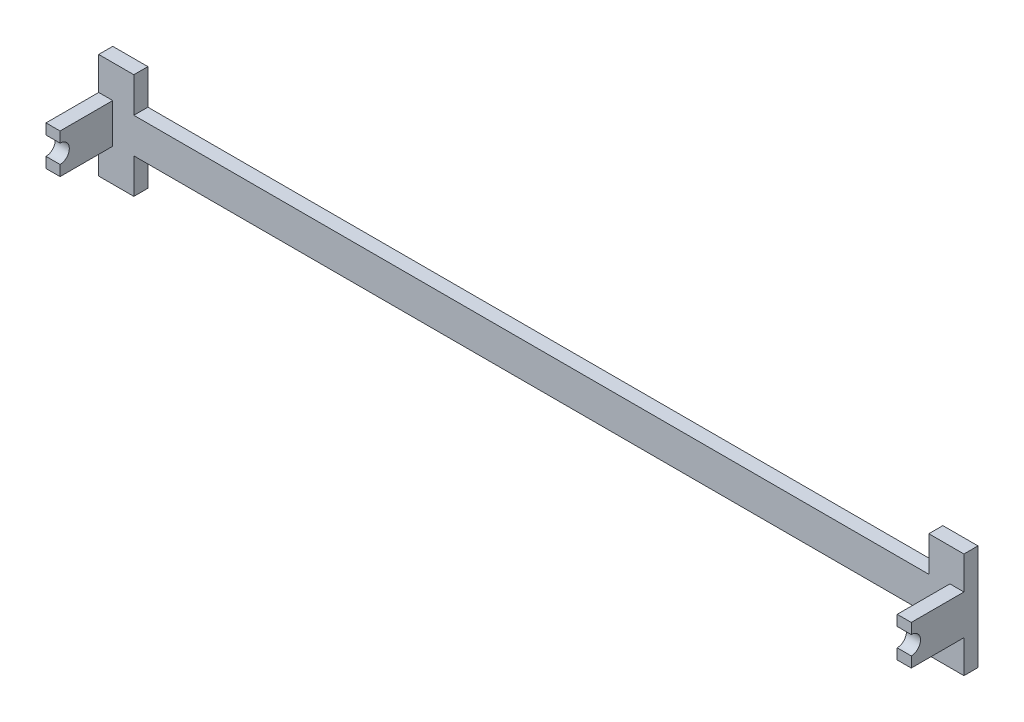
ISO-10303-21;
HEADER;
FILE_DESCRIPTION(('STEP AP214'),'2;1');
FILE_NAME('part.step','',(''),(''),'','','');
FILE_SCHEMA(('AUTOMOTIVE_DESIGN { 1 0 10303 214 1 1 1 1 }'));
ENDSEC;
DATA;
#1=APPLICATION_CONTEXT('core data for automotive mechanical design processes');
#2=APPLICATION_PROTOCOL_DEFINITION('international standard','automotive_design',2000,#1);
#3=PRODUCT_CONTEXT('',#1,'mechanical');
#4=PRODUCT('Part','Part','',(#3));
#5=PRODUCT_RELATED_PRODUCT_CATEGORY('part','',(#4));
#6=PRODUCT_DEFINITION_FORMATION('','',#4);
#7=PRODUCT_DEFINITION_CONTEXT('part definition',#1,'design');
#8=PRODUCT_DEFINITION('design','',#6,#7);
#9=PRODUCT_DEFINITION_SHAPE('','',#8);
#10=(LENGTH_UNIT() NAMED_UNIT(*) SI_UNIT(.MILLI.,.METRE.));
#11=(NAMED_UNIT(*) PLANE_ANGLE_UNIT() SI_UNIT($,.RADIAN.));
#12=(NAMED_UNIT(*) SI_UNIT($,.STERADIAN.) SOLID_ANGLE_UNIT());
#13=UNCERTAINTY_MEASURE_WITH_UNIT(LENGTH_MEASURE(1.E-05),#10,'distance_accuracy_value','');
#14=(GEOMETRIC_REPRESENTATION_CONTEXT(3) GLOBAL_UNCERTAINTY_ASSIGNED_CONTEXT((#13)) GLOBAL_UNIT_ASSIGNED_CONTEXT((#10,
#11,#12)) REPRESENTATION_CONTEXT('',''));
#15=CARTESIAN_POINT('',(0.,0.,0.));
#16=DIRECTION('',(0.,0.,1.));
#17=DIRECTION('',(1.,0.,0.));
#18=AXIS2_PLACEMENT_3D('',#15,#16,#17);
#19=CARTESIAN_POINT('',(-14.,5.,-19.));
#20=DIRECTION('',(-1.,0.,0.));
#21=DIRECTION('',(0.,0.,1.));
#22=AXIS2_PLACEMENT_3D('',#19,#20,#21);
#23=PLANE('',#22);
#24=DIRECTION('',(0.,-1.,0.));
#25=VECTOR('',#24,1.);
#26=CARTESIAN_POINT('',(-14.,5.,-15.));
#27=LINE('',#26,#25);
#28=CARTESIAN_POINT('',(-14.,15.,-15.));
#29=VERTEX_POINT('',#28);
#30=CARTESIAN_POINT('',(-14.,5.63,-15.));
#31=VERTEX_POINT('',#30);
#32=EDGE_CURVE('E379',#29,#31,#27,.T.);
#33=ORIENTED_EDGE('',*,*,#32,.F.);
#34=DIRECTION('',(0.,0.,-1.));
#35=VECTOR('',#34,1.);
#36=CARTESIAN_POINT('',(-14.,15.,-15.));
#37=LINE('',#36,#35);
#38=CARTESIAN_POINT('',(-14.,15.,-19.));
#39=VERTEX_POINT('',#38);
#40=EDGE_CURVE('E311',#29,#39,#37,.T.);
#41=ORIENTED_EDGE('',*,*,#40,.T.);
#42=DIRECTION('',(0.,-1.,0.));
#43=VECTOR('',#42,1.);
#44=CARTESIAN_POINT('',(-14.,5.,-19.));
#45=LINE('',#44,#43);
#46=CARTESIAN_POINT('',(-14.,-15.,-19.));
#47=VERTEX_POINT('',#46);
#48=EDGE_CURVE('E374',#39,#47,#45,.T.);
#49=ORIENTED_EDGE('',*,*,#48,.T.);
#50=DIRECTION('',(0.,0.,-1.));
#51=VECTOR('',#50,1.);
#52=CARTESIAN_POINT('',(-14.,-15.,-15.));
#53=LINE('',#52,#51);
#54=CARTESIAN_POINT('',(-14.,-15.,-15.));
#55=VERTEX_POINT('',#54);
#56=EDGE_CURVE('E322',#55,#47,#53,.T.);
#57=ORIENTED_EDGE('',*,*,#56,.F.);
#58=CARTESIAN_POINT('',(-14.,-5.63,-15.));
#59=VERTEX_POINT('',#58);
#60=EDGE_CURVE('E373',#59,#55,#27,.T.);
#61=ORIENTED_EDGE('',*,*,#60,.F.);
#62=DIRECTION('',(0.,0.,1.));
#63=VECTOR('',#62,1.);
#64=CARTESIAN_POINT('',(-14.,-5.63,-15.));
#65=LINE('',#64,#63);
#66=CARTESIAN_POINT('',(-14.,-5.63,0.));
#67=VERTEX_POINT('',#66);
#68=EDGE_CURVE('E229',#59,#67,#65,.T.);
#69=ORIENTED_EDGE('',*,*,#68,.T.);
#70=DIRECTION('',(0.,1.,0.));
#71=VECTOR('',#70,1.);
#72=CARTESIAN_POINT('',(-14.,-5.63,0.));
#73=LINE('',#72,#71);
#74=CARTESIAN_POINT('',(-14.,-2.63,0.));
#75=VERTEX_POINT('',#74);
#76=EDGE_CURVE('E226',#67,#75,#73,.T.);
#77=ORIENTED_EDGE('',*,*,#76,.T.);
#78=CARTESIAN_POINT('',(-14.,0.,0.));
#79=DIRECTION('',(1.,0.,0.));
#80=DIRECTION('',(0.,0.,1.));
#81=AXIS2_PLACEMENT_3D('',#78,#79,#80);
#82=CIRCLE('',#81,2.63);
#83=CARTESIAN_POINT('',(-14.,2.63,0.));
#84=VERTEX_POINT('',#83);
#85=EDGE_CURVE('E238',#75,#84,#82,.T.);
#86=ORIENTED_EDGE('',*,*,#85,.T.);
#87=DIRECTION('',(0.,1.,0.));
#88=VECTOR('',#87,1.);
#89=CARTESIAN_POINT('',(-14.,2.63,0.));
#90=LINE('',#89,#88);
#91=CARTESIAN_POINT('',(-14.,5.63,0.));
#92=VERTEX_POINT('',#91);
#93=EDGE_CURVE('E206',#84,#92,#90,.T.);
#94=ORIENTED_EDGE('',*,*,#93,.T.);
#95=DIRECTION('',(0.,0.,-1.));
#96=VECTOR('',#95,1.);
#97=CARTESIAN_POINT('',(-14.,5.63,0.));
#98=LINE('',#97,#96);
#99=EDGE_CURVE('E241',#92,#31,#98,.T.);
#100=ORIENTED_EDGE('',*,*,#99,.T.);
#101=EDGE_LOOP('',(#33,#41,#49,#57,#61,#69,#77,#86,#94,#100));
#102=FACE_BOUND('',#101,.T.);
#103=ADVANCED_FACE('F41',(#102),#23,.T.);
#104=CARTESIAN_POINT('',(-14.,5.,-19.));
#105=DIRECTION('',(0.,1.,0.));
#106=DIRECTION('',(0.,0.,1.));
#107=AXIS2_PLACEMENT_3D('',#104,#105,#106);
#108=PLANE('',#107);
#109=DIRECTION('',(0.,0.,-1.));
#110=VECTOR('',#109,1.);
#111=CARTESIAN_POINT('',(-4.,5.,-19.));
#112=LINE('',#111,#110);
#113=CARTESIAN_POINT('',(-4.,5.,-15.));
#114=VERTEX_POINT('',#113);
#115=CARTESIAN_POINT('',(-4.,5.,-19.));
#116=VERTEX_POINT('',#115);
#117=EDGE_CURVE('E370',#114,#116,#112,.T.);
#118=ORIENTED_EDGE('',*,*,#117,.F.);
#119=DIRECTION('',(-1.,0.,0.));
#120=VECTOR('',#119,1.);
#121=CARTESIAN_POINT('',(-14.,5.,-15.));
#122=LINE('',#121,#120);
#123=CARTESIAN_POINT('',(222.3,5.,-15.));
#124=VERTEX_POINT('',#123);
#125=EDGE_CURVE('E44',#124,#114,#122,.T.);
#126=ORIENTED_EDGE('',*,*,#125,.F.);
#127=DIRECTION('',(0.,0.,1.));
#128=VECTOR('',#127,1.);
#129=CARTESIAN_POINT('',(222.3,5.,-19.));
#130=LINE('',#129,#128);
#131=CARTESIAN_POINT('',(222.3,5.,-19.));
#132=VERTEX_POINT('',#131);
#133=EDGE_CURVE('E364',#132,#124,#130,.T.);
#134=ORIENTED_EDGE('',*,*,#133,.F.);
#135=DIRECTION('',(-1.,0.,0.));
#136=VECTOR('',#135,1.);
#137=CARTESIAN_POINT('',(-14.,5.,-19.));
#138=LINE('',#137,#136);
#139=EDGE_CURVE('E11',#132,#116,#138,.T.);
#140=ORIENTED_EDGE('',*,*,#139,.T.);
#141=EDGE_LOOP('',(#118,#126,#134,#140));
#142=FACE_BOUND('',#141,.T.);
#143=ADVANCED_FACE('F476',(#142),#108,.T.);
#144=CARTESIAN_POINT('',(232.3,5.,-19.));
#145=DIRECTION('',(1.,0.,0.));
#146=DIRECTION('',(0.,0.,-1.));
#147=AXIS2_PLACEMENT_3D('',#144,#145,#146);
#148=PLANE('',#147);
#149=DIRECTION('',(0.,1.,0.));
#150=VECTOR('',#149,1.);
#151=CARTESIAN_POINT('',(232.3,5.,-15.));
#152=LINE('',#151,#150);
#153=CARTESIAN_POINT('',(232.3,-15.,-15.));
#154=VERTEX_POINT('',#153);
#155=CARTESIAN_POINT('',(232.3,-5.63,-15.));
#156=VERTEX_POINT('',#155);
#157=EDGE_CURVE('E384',#154,#156,#152,.T.);
#158=ORIENTED_EDGE('',*,*,#157,.F.);
#159=DIRECTION('',(0.,0.,-1.));
#160=VECTOR('',#159,1.);
#161=CARTESIAN_POINT('',(232.3,-15.,-15.));
#162=LINE('',#161,#160);
#163=CARTESIAN_POINT('',(232.3,-15.,-19.));
#164=VERTEX_POINT('',#163);
#165=EDGE_CURVE('E333',#154,#164,#162,.T.);
#166=ORIENTED_EDGE('',*,*,#165,.T.);
#167=DIRECTION('',(0.,1.,0.));
#168=VECTOR('',#167,1.);
#169=CARTESIAN_POINT('',(232.3,5.,-19.));
#170=LINE('',#169,#168);
#171=CARTESIAN_POINT('',(232.3,15.,-19.));
#172=VERTEX_POINT('',#171);
#173=EDGE_CURVE('E49',#164,#172,#170,.T.);
#174=ORIENTED_EDGE('',*,*,#173,.T.);
#175=DIRECTION('',(0.,0.,-1.));
#176=VECTOR('',#175,1.);
#177=CARTESIAN_POINT('',(232.3,15.,-15.));
#178=LINE('',#177,#176);
#179=CARTESIAN_POINT('',(232.3,15.,-15.));
#180=VERTEX_POINT('',#179);
#181=EDGE_CURVE('E289',#180,#172,#178,.T.);
#182=ORIENTED_EDGE('',*,*,#181,.F.);
#183=CARTESIAN_POINT('',(232.3,5.63,-15.));
#184=VERTEX_POINT('',#183);
#185=EDGE_CURVE('E383',#184,#180,#152,.T.);
#186=ORIENTED_EDGE('',*,*,#185,.F.);
#187=DIRECTION('',(0.,0.,1.));
#188=VECTOR('',#187,1.);
#189=CARTESIAN_POINT('',(232.3,5.63,0.));
#190=LINE('',#189,#188);
#191=CARTESIAN_POINT('',(232.3,5.63,0.));
#192=VERTEX_POINT('',#191);
#193=EDGE_CURVE('E282',#184,#192,#190,.T.);
#194=ORIENTED_EDGE('',*,*,#193,.T.);
#195=DIRECTION('',(0.,-1.,0.));
#196=VECTOR('',#195,1.);
#197=CARTESIAN_POINT('',(232.3,2.63,0.));
#198=LINE('',#197,#196);
#199=CARTESIAN_POINT('',(232.3,2.63,0.));
#200=VERTEX_POINT('',#199);
#201=EDGE_CURVE('E258',#192,#200,#198,.T.);
#202=ORIENTED_EDGE('',*,*,#201,.T.);
#203=CARTESIAN_POINT('',(232.3,0.,0.));
#204=DIRECTION('',(-1.,0.,0.));
#205=DIRECTION('',(0.,0.,-1.));
#206=AXIS2_PLACEMENT_3D('',#203,#204,#205);
#207=CIRCLE('',#206,2.63);
#208=CARTESIAN_POINT('',(232.3,-2.63,0.));
#209=VERTEX_POINT('',#208);
#210=EDGE_CURVE('E247',#200,#209,#207,.T.);
#211=ORIENTED_EDGE('',*,*,#210,.T.);
#212=DIRECTION('',(0.,-1.,0.));
#213=VECTOR('',#212,1.);
#214=CARTESIAN_POINT('',(232.3,-2.63,0.));
#215=LINE('',#214,#213);
#216=CARTESIAN_POINT('',(232.3,-5.63,0.));
#217=VERTEX_POINT('',#216);
#218=EDGE_CURVE('E276',#209,#217,#215,.T.);
#219=ORIENTED_EDGE('',*,*,#218,.T.);
#220=DIRECTION('',(0.,0.,-1.));
#221=VECTOR('',#220,1.);
#222=CARTESIAN_POINT('',(232.3,-5.63,-15.));
#223=LINE('',#222,#221);
#224=EDGE_CURVE('E279',#217,#156,#223,.T.);
#225=ORIENTED_EDGE('',*,*,#224,.T.);
#226=EDGE_LOOP('',(#158,#166,#174,#182,#186,#194,#202,#211,#219,#225));
#227=FACE_BOUND('',#226,.T.);
#228=ADVANCED_FACE('F395',(#227),#148,.T.);
#229=CARTESIAN_POINT('',(-14.,-5.,-19.));
#230=DIRECTION('',(0.,-1.,0.));
#231=DIRECTION('',(0.,0.,-1.));
#232=AXIS2_PLACEMENT_3D('',#229,#230,#231);
#233=PLANE('',#232);
#234=DIRECTION('',(0.,0.,1.));
#235=VECTOR('',#234,1.);
#236=CARTESIAN_POINT('',(-4.,-5.,-19.));
#237=LINE('',#236,#235);
#238=CARTESIAN_POINT('',(-4.,-4.99999999999999,-19.));
#239=VERTEX_POINT('',#238);
#240=CARTESIAN_POINT('',(-4.,-5.,-15.));
#241=VERTEX_POINT('',#240);
#242=EDGE_CURVE('E367',#239,#241,#237,.T.);
#243=ORIENTED_EDGE('',*,*,#242,.F.);
#244=DIRECTION('',(1.,0.,0.));
#245=VECTOR('',#244,1.);
#246=CARTESIAN_POINT('',(-14.,-5.,-19.));
#247=LINE('',#246,#245);
#248=CARTESIAN_POINT('',(222.3,-5.,-19.));
#249=VERTEX_POINT('',#248);
#250=EDGE_CURVE('E376',#239,#249,#247,.T.);
#251=ORIENTED_EDGE('',*,*,#250,.T.);
#252=DIRECTION('',(0.,0.,-1.));
#253=VECTOR('',#252,1.);
#254=CARTESIAN_POINT('',(222.3,-5.,-19.));
#255=LINE('',#254,#253);
#256=CARTESIAN_POINT('',(222.3,-5.,-15.));
#257=VERTEX_POINT('',#256);
#258=EDGE_CURVE('E325',#257,#249,#255,.T.);
#259=ORIENTED_EDGE('',*,*,#258,.F.);
#260=DIRECTION('',(1.,0.,0.));
#261=VECTOR('',#260,1.);
#262=CARTESIAN_POINT('',(-14.,-5.,-15.));
#263=LINE('',#262,#261);
#264=EDGE_CURVE('E381',#241,#257,#263,.T.);
#265=ORIENTED_EDGE('',*,*,#264,.F.);
#266=EDGE_LOOP('',(#243,#251,#259,#265));
#267=FACE_BOUND('',#266,.T.);
#268=ADVANCED_FACE('F486',(#267),#233,.T.);
#269=CARTESIAN_POINT('',(0.,0.,-19.));
#270=DIRECTION('',(0.,0.,1.));
#271=DIRECTION('',(1.,0.,0.));
#272=AXIS2_PLACEMENT_3D('',#269,#270,#271);
#273=PLANE('',#272);
#274=ORIENTED_EDGE('',*,*,#250,.F.);
#275=DIRECTION('',(0.,-1.,0.));
#276=VECTOR('',#275,1.);
#277=CARTESIAN_POINT('',(-4.,15.,-19.));
#278=LINE('',#277,#276);
#279=CARTESIAN_POINT('',(-4.,-15.,-19.));
#280=VERTEX_POINT('',#279);
#281=EDGE_CURVE('E315',#239,#280,#278,.T.);
#282=ORIENTED_EDGE('',*,*,#281,.T.);
#283=DIRECTION('',(-1.,0.,0.));
#284=VECTOR('',#283,1.);
#285=CARTESIAN_POINT('',(-14.,-15.,-19.));
#286=LINE('',#285,#284);
#287=EDGE_CURVE('E304',#280,#47,#286,.T.);
#288=ORIENTED_EDGE('',*,*,#287,.T.);
#289=ORIENTED_EDGE('',*,*,#48,.F.);
#290=DIRECTION('',(1.,0.,0.));
#291=VECTOR('',#290,1.);
#292=CARTESIAN_POINT('',(-14.,15.,-19.));
#293=LINE('',#292,#291);
#294=CARTESIAN_POINT('',(-4.,15.,-19.));
#295=VERTEX_POINT('',#294);
#296=EDGE_CURVE('E312',#39,#295,#293,.T.);
#297=ORIENTED_EDGE('',*,*,#296,.T.);
#298=EDGE_CURVE('E317',#295,#116,#278,.T.);
#299=ORIENTED_EDGE('',*,*,#298,.T.);
#300=ORIENTED_EDGE('',*,*,#139,.F.);
#301=DIRECTION('',(0.,1.,0.));
#302=VECTOR('',#301,1.);
#303=CARTESIAN_POINT('',(222.3,-15.,-19.));
#304=LINE('',#303,#302);
#305=CARTESIAN_POINT('',(222.3,15.,-19.));
#306=VERTEX_POINT('',#305);
#307=EDGE_CURVE('E347',#132,#306,#304,.T.);
#308=ORIENTED_EDGE('',*,*,#307,.T.);
#309=DIRECTION('',(1.,0.,0.));
#310=VECTOR('',#309,1.);
#311=CARTESIAN_POINT('',(232.3,15.,-19.));
#312=LINE('',#311,#310);
#313=EDGE_CURVE('E344',#306,#172,#312,.T.);
#314=ORIENTED_EDGE('',*,*,#313,.T.);
#315=ORIENTED_EDGE('',*,*,#173,.F.);
#316=DIRECTION('',(-1.,0.,0.));
#317=VECTOR('',#316,1.);
#318=CARTESIAN_POINT('',(232.3,-15.,-19.));
#319=LINE('',#318,#317);
#320=CARTESIAN_POINT('',(222.3,-15.,-19.));
#321=VERTEX_POINT('',#320);
#322=EDGE_CURVE('E316',#164,#321,#319,.T.);
#323=ORIENTED_EDGE('',*,*,#322,.T.);
#324=EDGE_CURVE('E349',#321,#249,#304,.T.);
#325=ORIENTED_EDGE('',*,*,#324,.T.);
#326=EDGE_LOOP('',(#274,#282,#288,#289,#297,#299,#300,#308,#314,#315,#323,#325));
#327=FACE_BOUND('',#326,.T.);
#328=ADVANCED_FACE('F490',(#327),#273,.F.);
#329=CARTESIAN_POINT('',(0.,0.,-15.));
#330=DIRECTION('',(0.,0.,1.));
#331=DIRECTION('',(1.,0.,0.));
#332=AXIS2_PLACEMENT_3D('',#329,#330,#331);
#333=PLANE('',#332);
#334=DIRECTION('',(-1.,0.,0.));
#335=VECTOR('',#334,1.);
#336=CARTESIAN_POINT('',(-10.,-5.63,-15.));
#337=LINE('',#336,#335);
#338=CARTESIAN_POINT('',(-10.,-5.63,-15.));
#339=VERTEX_POINT('',#338);
#340=EDGE_CURVE('E250',#339,#59,#337,.T.);
#341=ORIENTED_EDGE('',*,*,#340,.T.);
#342=ORIENTED_EDGE('',*,*,#60,.T.);
#343=DIRECTION('',(-1.,0.,0.));
#344=VECTOR('',#343,1.);
#345=CARTESIAN_POINT('',(-14.,-15.,-15.));
#346=LINE('',#345,#344);
#347=CARTESIAN_POINT('',(-4.,-15.,-15.));
#348=VERTEX_POINT('',#347);
#349=EDGE_CURVE('E308',#348,#55,#346,.T.);
#350=ORIENTED_EDGE('',*,*,#349,.F.);
#351=DIRECTION('',(0.,-1.,0.));
#352=VECTOR('',#351,1.);
#353=CARTESIAN_POINT('',(-4.,15.,-15.));
#354=LINE('',#353,#352);
#355=EDGE_CURVE('E303',#241,#348,#354,.T.);
#356=ORIENTED_EDGE('',*,*,#355,.F.);
#357=ORIENTED_EDGE('',*,*,#264,.T.);
#358=DIRECTION('',(0.,1.,0.));
#359=VECTOR('',#358,1.);
#360=CARTESIAN_POINT('',(222.3,-15.,-15.));
#361=LINE('',#360,#359);
#362=CARTESIAN_POINT('',(222.3,-15.,-15.));
#363=VERTEX_POINT('',#362);
#364=EDGE_CURVE('E357',#363,#257,#361,.T.);
#365=ORIENTED_EDGE('',*,*,#364,.F.);
#366=DIRECTION('',(-1.,0.,0.));
#367=VECTOR('',#366,1.);
#368=CARTESIAN_POINT('',(232.3,-15.,-15.));
#369=LINE('',#368,#367);
#370=EDGE_CURVE('E348',#154,#363,#369,.T.);
#371=ORIENTED_EDGE('',*,*,#370,.F.);
#372=ORIENTED_EDGE('',*,*,#157,.T.);
#373=DIRECTION('',(1.,0.,0.));
#374=VECTOR('',#373,1.);
#375=CARTESIAN_POINT('',(228.3,-5.63,-15.));
#376=LINE('',#375,#374);
#377=CARTESIAN_POINT('',(228.3,-5.63,-15.));
#378=VERTEX_POINT('',#377);
#379=EDGE_CURVE('E295',#378,#156,#376,.T.);
#380=ORIENTED_EDGE('',*,*,#379,.F.);
#381=DIRECTION('',(0.,1.,0.));
#382=VECTOR('',#381,1.);
#383=CARTESIAN_POINT('',(228.3,5.63,-15.));
#384=LINE('',#383,#382);
#385=CARTESIAN_POINT('',(228.3,5.63,-15.));
#386=VERTEX_POINT('',#385);
#387=EDGE_CURVE('E264',#378,#386,#384,.T.);
#388=ORIENTED_EDGE('',*,*,#387,.T.);
#389=DIRECTION('',(1.,0.,0.));
#390=VECTOR('',#389,1.);
#391=CARTESIAN_POINT('',(228.3,5.63,-15.));
#392=LINE('',#391,#390);
#393=EDGE_CURVE('E292',#386,#184,#392,.T.);
#394=ORIENTED_EDGE('',*,*,#393,.T.);
#395=ORIENTED_EDGE('',*,*,#185,.T.);
#396=DIRECTION('',(1.,0.,0.));
#397=VECTOR('',#396,1.);
#398=CARTESIAN_POINT('',(232.3,15.,-15.));
#399=LINE('',#398,#397);
#400=CARTESIAN_POINT('',(222.3,15.,-15.));
#401=VERTEX_POINT('',#400);
#402=EDGE_CURVE('E336',#401,#180,#399,.T.);
#403=ORIENTED_EDGE('',*,*,#402,.F.);
#404=EDGE_CURVE('E356',#124,#401,#361,.T.);
#405=ORIENTED_EDGE('',*,*,#404,.F.);
#406=ORIENTED_EDGE('',*,*,#125,.T.);
#407=CARTESIAN_POINT('',(-4.,15.,-15.));
#408=VERTEX_POINT('',#407);
#409=EDGE_CURVE('E305',#408,#114,#354,.T.);
#410=ORIENTED_EDGE('',*,*,#409,.F.);
#411=DIRECTION('',(1.,0.,0.));
#412=VECTOR('',#411,1.);
#413=CARTESIAN_POINT('',(-14.,15.,-15.));
#414=LINE('',#413,#412);
#415=EDGE_CURVE('E300',#29,#408,#414,.T.);
#416=ORIENTED_EDGE('',*,*,#415,.F.);
#417=ORIENTED_EDGE('',*,*,#32,.T.);
#418=DIRECTION('',(-1.,0.,0.));
#419=VECTOR('',#418,1.);
#420=CARTESIAN_POINT('',(-10.,5.63,-15.));
#421=LINE('',#420,#419);
#422=CARTESIAN_POINT('',(-10.,5.63,-15.));
#423=VERTEX_POINT('',#422);
#424=EDGE_CURVE('E62',#423,#31,#421,.T.);
#425=ORIENTED_EDGE('',*,*,#424,.F.);
#426=DIRECTION('',(0.,-1.,0.));
#427=VECTOR('',#426,1.);
#428=CARTESIAN_POINT('',(-10.,5.63,-15.));
#429=LINE('',#428,#427);
#430=EDGE_CURVE('E57',#423,#339,#429,.T.);
#431=ORIENTED_EDGE('',*,*,#430,.T.);
#432=EDGE_LOOP('',(#341,#342,#350,#356,#357,#365,#371,#372,#380,#388,#394,#395,#403,#405,#406,
#410,#416,#417,#425,#431));
#433=FACE_BOUND('',#432,.T.);
#434=ADVANCED_FACE('F392',(#433),#333,.T.);
#435=CARTESIAN_POINT('',(232.3,-15.,-15.));
#436=DIRECTION('',(0.,-1.,0.));
#437=DIRECTION('',(0.,0.,-1.));
#438=AXIS2_PLACEMENT_3D('',#435,#436,#437);
#439=PLANE('',#438);
#440=ORIENTED_EDGE('',*,*,#322,.F.);
#441=ORIENTED_EDGE('',*,*,#165,.F.);
#442=ORIENTED_EDGE('',*,*,#370,.T.);
#443=DIRECTION('',(0.,0.,-1.));
#444=VECTOR('',#443,1.);
#445=CARTESIAN_POINT('',(222.3,-15.,-15.));
#446=LINE('',#445,#444);
#447=EDGE_CURVE('E337',#363,#321,#446,.T.);
#448=ORIENTED_EDGE('',*,*,#447,.T.);
#449=EDGE_LOOP('',(#440,#441,#442,#448));
#450=FACE_BOUND('',#449,.T.);
#451=ADVANCED_FACE('F443',(#450),#439,.T.);
#452=CARTESIAN_POINT('',(222.3,-15.,-15.));
#453=DIRECTION('',(-1.,0.,0.));
#454=DIRECTION('',(0.,0.,1.));
#455=AXIS2_PLACEMENT_3D('',#452,#453,#454);
#456=PLANE('',#455);
#457=ORIENTED_EDGE('',*,*,#364,.T.);
#458=ORIENTED_EDGE('',*,*,#258,.T.);
#459=ORIENTED_EDGE('',*,*,#324,.F.);
#460=ORIENTED_EDGE('',*,*,#447,.F.);
#461=EDGE_LOOP('',(#457,#458,#459,#460));
#462=FACE_BOUND('',#461,.T.);
#463=ADVANCED_FACE('F439',(#462),#456,.T.);
#464=CARTESIAN_POINT('',(-14.,-15.,-15.));
#465=DIRECTION('',(0.,-1.,0.));
#466=DIRECTION('',(1.,0.,0.));
#467=AXIS2_PLACEMENT_3D('',#464,#465,#466);
#468=PLANE('',#467);
#469=ORIENTED_EDGE('',*,*,#287,.F.);
#470=DIRECTION('',(0.,0.,-1.));
#471=VECTOR('',#470,1.);
#472=CARTESIAN_POINT('',(-4.,-15.,-15.));
#473=LINE('',#472,#471);
#474=EDGE_CURVE('E326',#348,#280,#473,.T.);
#475=ORIENTED_EDGE('',*,*,#474,.F.);
#476=ORIENTED_EDGE('',*,*,#349,.T.);
#477=ORIENTED_EDGE('',*,*,#56,.T.);
#478=EDGE_LOOP('',(#469,#475,#476,#477));
#479=FACE_BOUND('',#478,.T.);
#480=ADVANCED_FACE('F431',(#479),#468,.T.);
#481=CARTESIAN_POINT('',(-4.,15.,-15.));
#482=DIRECTION('',(1.,0.,0.));
#483=DIRECTION('',(0.,1.,0.));
#484=AXIS2_PLACEMENT_3D('',#481,#482,#483);
#485=PLANE('',#484);
#486=ORIENTED_EDGE('',*,*,#281,.F.);
#487=ORIENTED_EDGE('',*,*,#242,.T.);
#488=ORIENTED_EDGE('',*,*,#355,.T.);
#489=ORIENTED_EDGE('',*,*,#474,.T.);
#490=EDGE_LOOP('',(#486,#487,#488,#489));
#491=FACE_BOUND('',#490,.T.);
#492=ADVANCED_FACE('F434',(#491),#485,.T.);
#493=ORIENTED_EDGE('',*,*,#307,.F.);
#494=ORIENTED_EDGE('',*,*,#133,.T.);
#495=ORIENTED_EDGE('',*,*,#404,.T.);
#496=DIRECTION('',(0.,0.,-1.));
#497=VECTOR('',#496,1.);
#498=CARTESIAN_POINT('',(222.3,15.,-15.));
#499=LINE('',#498,#497);
#500=EDGE_CURVE('E339',#401,#306,#499,.T.);
#501=ORIENTED_EDGE('',*,*,#500,.T.);
#502=EDGE_LOOP('',(#493,#494,#495,#501));
#503=FACE_BOUND('',#502,.T.);
#504=ADVANCED_FACE('F402',(#503),#456,.T.);
#505=CARTESIAN_POINT('',(232.3,15.,-15.));
#506=DIRECTION('',(0.,1.,0.));
#507=DIRECTION('',(0.,0.,1.));
#508=AXIS2_PLACEMENT_3D('',#505,#506,#507);
#509=PLANE('',#508);
#510=ORIENTED_EDGE('',*,*,#313,.F.);
#511=ORIENTED_EDGE('',*,*,#500,.F.);
#512=ORIENTED_EDGE('',*,*,#402,.T.);
#513=ORIENTED_EDGE('',*,*,#181,.T.);
#514=EDGE_LOOP('',(#510,#511,#512,#513));
#515=FACE_BOUND('',#514,.T.);
#516=ADVANCED_FACE('F399',(#515),#509,.T.);
#517=ORIENTED_EDGE('',*,*,#409,.T.);
#518=ORIENTED_EDGE('',*,*,#117,.T.);
#519=ORIENTED_EDGE('',*,*,#298,.F.);
#520=DIRECTION('',(0.,0.,-1.));
#521=VECTOR('',#520,1.);
#522=CARTESIAN_POINT('',(-4.,15.,-15.));
#523=LINE('',#522,#521);
#524=EDGE_CURVE('E329',#408,#295,#523,.T.);
#525=ORIENTED_EDGE('',*,*,#524,.F.);
#526=EDGE_LOOP('',(#517,#518,#519,#525));
#527=FACE_BOUND('',#526,.T.);
#528=ADVANCED_FACE('F408',(#527),#485,.T.);
#529=CARTESIAN_POINT('',(-14.,15.,-15.));
#530=DIRECTION('',(0.,1.,0.));
#531=DIRECTION('',(0.,0.,1.));
#532=AXIS2_PLACEMENT_3D('',#529,#530,#531);
#533=PLANE('',#532);
#534=ORIENTED_EDGE('',*,*,#296,.F.);
#535=ORIENTED_EDGE('',*,*,#40,.F.);
#536=ORIENTED_EDGE('',*,*,#415,.T.);
#537=ORIENTED_EDGE('',*,*,#524,.T.);
#538=EDGE_LOOP('',(#534,#535,#536,#537));
#539=FACE_BOUND('',#538,.T.);
#540=ADVANCED_FACE('F412',(#539),#533,.T.);
#541=CARTESIAN_POINT('',(228.3,0.,0.));
#542=DIRECTION('',(1.,0.,0.));
#543=DIRECTION('',(0.,0.,-1.));
#544=AXIS2_PLACEMENT_3D('',#541,#542,#543);
#545=CYLINDRICAL_SURFACE('',#544,2.63);
#546=ORIENTED_EDGE('',*,*,#210,.F.);
#547=DIRECTION('',(1.,0.,0.));
#548=VECTOR('',#547,1.);
#549=CARTESIAN_POINT('',(228.3,2.63,0.));
#550=LINE('',#549,#548);
#551=CARTESIAN_POINT('',(228.3,2.63,0.));
#552=VERTEX_POINT('',#551);
#553=EDGE_CURVE('E287',#552,#200,#550,.T.);
#554=ORIENTED_EDGE('',*,*,#553,.F.);
#555=CARTESIAN_POINT('',(228.3,0.,0.));
#556=DIRECTION('',(-1.,0.,0.));
#557=DIRECTION('',(0.,0.,-1.));
#558=AXIS2_PLACEMENT_3D('',#555,#556,#557);
#559=CIRCLE('',#558,2.63);
#560=CARTESIAN_POINT('',(228.3,-2.63,0.));
#561=VERTEX_POINT('',#560);
#562=EDGE_CURVE('E254',#552,#561,#559,.T.);
#563=ORIENTED_EDGE('',*,*,#562,.T.);
#564=DIRECTION('',(1.,0.,0.));
#565=VECTOR('',#564,1.);
#566=CARTESIAN_POINT('',(228.3,-2.63,0.));
#567=LINE('',#566,#565);
#568=EDGE_CURVE('E273',#561,#209,#567,.T.);
#569=ORIENTED_EDGE('',*,*,#568,.T.);
#570=EDGE_LOOP('',(#546,#554,#563,#569));
#571=FACE_BOUND('',#570,.T.);
#572=ADVANCED_FACE('F463',(#571),#545,.F.);
#573=CARTESIAN_POINT('',(228.3,2.63,0.));
#574=DIRECTION('',(0.,0.,1.));
#575=DIRECTION('',(0.,-1.,0.));
#576=AXIS2_PLACEMENT_3D('',#573,#574,#575);
#577=PLANE('',#576);
#578=ORIENTED_EDGE('',*,*,#201,.F.);
#579=DIRECTION('',(1.,0.,0.));
#580=VECTOR('',#579,1.);
#581=CARTESIAN_POINT('',(228.3,5.63,0.));
#582=LINE('',#581,#580);
#583=CARTESIAN_POINT('',(228.3,5.63,0.));
#584=VERTEX_POINT('',#583);
#585=EDGE_CURVE('E290',#584,#192,#582,.T.);
#586=ORIENTED_EDGE('',*,*,#585,.F.);
#587=DIRECTION('',(0.,-1.,0.));
#588=VECTOR('',#587,1.);
#589=CARTESIAN_POINT('',(228.3,2.63,0.));
#590=LINE('',#589,#588);
#591=EDGE_CURVE('E270',#584,#552,#590,.T.);
#592=ORIENTED_EDGE('',*,*,#591,.T.);
#593=ORIENTED_EDGE('',*,*,#553,.T.);
#594=EDGE_LOOP('',(#578,#586,#592,#593));
#595=FACE_BOUND('',#594,.T.);
#596=ADVANCED_FACE('F460',(#595),#577,.T.);
#597=CARTESIAN_POINT('',(228.3,5.63,0.));
#598=DIRECTION('',(0.,1.,0.));
#599=DIRECTION('',(0.,0.,1.));
#600=AXIS2_PLACEMENT_3D('',#597,#598,#599);
#601=PLANE('',#600);
#602=ORIENTED_EDGE('',*,*,#193,.F.);
#603=ORIENTED_EDGE('',*,*,#393,.F.);
#604=DIRECTION('',(0.,0.,1.));
#605=VECTOR('',#604,1.);
#606=CARTESIAN_POINT('',(228.3,5.63,0.));
#607=LINE('',#606,#605);
#608=EDGE_CURVE('E267',#386,#584,#607,.T.);
#609=ORIENTED_EDGE('',*,*,#608,.T.);
#610=ORIENTED_EDGE('',*,*,#585,.T.);
#611=EDGE_LOOP('',(#602,#603,#609,#610));
#612=FACE_BOUND('',#611,.T.);
#613=ADVANCED_FACE('F457',(#612),#601,.T.);
#614=CARTESIAN_POINT('',(228.3,-5.63,-15.));
#615=DIRECTION('',(0.,-1.,0.));
#616=DIRECTION('',(0.,0.,-1.));
#617=AXIS2_PLACEMENT_3D('',#614,#615,#616);
#618=PLANE('',#617);
#619=ORIENTED_EDGE('',*,*,#224,.F.);
#620=DIRECTION('',(1.,0.,0.));
#621=VECTOR('',#620,1.);
#622=CARTESIAN_POINT('',(228.3,-5.63,0.));
#623=LINE('',#622,#621);
#624=CARTESIAN_POINT('',(228.3,-5.63,0.));
#625=VERTEX_POINT('',#624);
#626=EDGE_CURVE('E297',#625,#217,#623,.T.);
#627=ORIENTED_EDGE('',*,*,#626,.F.);
#628=DIRECTION('',(0.,0.,-1.));
#629=VECTOR('',#628,1.);
#630=CARTESIAN_POINT('',(228.3,-5.63,-15.));
#631=LINE('',#630,#629);
#632=EDGE_CURVE('E261',#625,#378,#631,.T.);
#633=ORIENTED_EDGE('',*,*,#632,.T.);
#634=ORIENTED_EDGE('',*,*,#379,.T.);
#635=EDGE_LOOP('',(#619,#627,#633,#634));
#636=FACE_BOUND('',#635,.T.);
#637=ADVANCED_FACE('F448',(#636),#618,.T.);
#638=CARTESIAN_POINT('',(228.3,-2.63,0.));
#639=DIRECTION('',(0.,0.,1.));
#640=DIRECTION('',(0.,-1.,0.));
#641=AXIS2_PLACEMENT_3D('',#638,#639,#640);
#642=PLANE('',#641);
#643=ORIENTED_EDGE('',*,*,#218,.F.);
#644=ORIENTED_EDGE('',*,*,#568,.F.);
#645=DIRECTION('',(0.,-1.,0.));
#646=VECTOR('',#645,1.);
#647=CARTESIAN_POINT('',(228.3,-2.63,0.));
#648=LINE('',#647,#646);
#649=EDGE_CURVE('E257',#561,#625,#648,.T.);
#650=ORIENTED_EDGE('',*,*,#649,.T.);
#651=ORIENTED_EDGE('',*,*,#626,.T.);
#652=EDGE_LOOP('',(#643,#644,#650,#651));
#653=FACE_BOUND('',#652,.T.);
#654=ADVANCED_FACE('F465',(#653),#642,.T.);
#655=CARTESIAN_POINT('',(228.3,0.,0.));
#656=DIRECTION('',(1.,0.,0.));
#657=DIRECTION('',(0.,0.,-1.));
#658=AXIS2_PLACEMENT_3D('',#655,#656,#657);
#659=PLANE('',#658);
#660=ORIENTED_EDGE('',*,*,#562,.F.);
#661=ORIENTED_EDGE('',*,*,#591,.F.);
#662=ORIENTED_EDGE('',*,*,#608,.F.);
#663=ORIENTED_EDGE('',*,*,#387,.F.);
#664=ORIENTED_EDGE('',*,*,#632,.F.);
#665=ORIENTED_EDGE('',*,*,#649,.F.);
#666=EDGE_LOOP('',(#660,#661,#662,#663,#664,#665));
#667=FACE_BOUND('',#666,.T.);
#668=ADVANCED_FACE('F453',(#667),#659,.F.);
#669=CARTESIAN_POINT('',(-10.,0.,0.));
#670=DIRECTION('',(-1.,0.,0.));
#671=DIRECTION('',(0.,0.,1.));
#672=AXIS2_PLACEMENT_3D('',#669,#670,#671);
#673=CYLINDRICAL_SURFACE('',#672,2.63);
#674=ORIENTED_EDGE('',*,*,#85,.F.);
#675=DIRECTION('',(-1.,0.,0.));
#676=VECTOR('',#675,1.);
#677=CARTESIAN_POINT('',(-10.,-2.63,0.));
#678=LINE('',#677,#676);
#679=CARTESIAN_POINT('',(-10.,-2.63,0.));
#680=VERTEX_POINT('',#679);
#681=EDGE_CURVE('E225',#680,#75,#678,.T.);
#682=ORIENTED_EDGE('',*,*,#681,.F.);
#683=CARTESIAN_POINT('',(-10.,0.,0.));
#684=DIRECTION('',(1.,0.,0.));
#685=DIRECTION('',(0.,0.,1.));
#686=AXIS2_PLACEMENT_3D('',#683,#684,#685);
#687=CIRCLE('',#686,2.63);
#688=CARTESIAN_POINT('',(-10.,2.63,0.));
#689=VERTEX_POINT('',#688);
#690=EDGE_CURVE('E219',#680,#689,#687,.T.);
#691=ORIENTED_EDGE('',*,*,#690,.T.);
#692=DIRECTION('',(-1.,0.,0.));
#693=VECTOR('',#692,1.);
#694=CARTESIAN_POINT('',(-10.,2.63,0.));
#695=LINE('',#694,#693);
#696=EDGE_CURVE('E201',#689,#84,#695,.T.);
#697=ORIENTED_EDGE('',*,*,#696,.T.);
#698=EDGE_LOOP('',(#674,#682,#691,#697));
#699=FACE_BOUND('',#698,.T.);
#700=ADVANCED_FACE('F224',(#699),#673,.F.);
#701=CARTESIAN_POINT('',(-10.,-5.63,0.));
#702=DIRECTION('',(0.,0.,1.));
#703=DIRECTION('',(0.,-1.,0.));
#704=AXIS2_PLACEMENT_3D('',#701,#702,#703);
#705=PLANE('',#704);
#706=ORIENTED_EDGE('',*,*,#76,.F.);
#707=DIRECTION('',(-1.,0.,0.));
#708=VECTOR('',#707,1.);
#709=CARTESIAN_POINT('',(-10.,-5.63,0.));
#710=LINE('',#709,#708);
#711=CARTESIAN_POINT('',(-10.,-5.63,0.));
#712=VERTEX_POINT('',#711);
#713=EDGE_CURVE('E248',#712,#67,#710,.T.);
#714=ORIENTED_EDGE('',*,*,#713,.F.);
#715=DIRECTION('',(0.,1.,0.));
#716=VECTOR('',#715,1.);
#717=CARTESIAN_POINT('',(-10.,-5.63,0.));
#718=LINE('',#717,#716);
#719=EDGE_CURVE('E212',#712,#680,#718,.T.);
#720=ORIENTED_EDGE('',*,*,#719,.T.);
#721=ORIENTED_EDGE('',*,*,#681,.T.);
#722=EDGE_LOOP('',(#706,#714,#720,#721));
#723=FACE_BOUND('',#722,.T.);
#724=ADVANCED_FACE('F421',(#723),#705,.T.);
#725=CARTESIAN_POINT('',(-10.,-5.63,-15.));
#726=DIRECTION('',(0.,-1.,0.));
#727=DIRECTION('',(0.,0.,-1.));
#728=AXIS2_PLACEMENT_3D('',#725,#726,#727);
#729=PLANE('',#728);
#730=ORIENTED_EDGE('',*,*,#68,.F.);
#731=ORIENTED_EDGE('',*,*,#340,.F.);
#732=DIRECTION('',(0.,0.,1.));
#733=VECTOR('',#732,1.);
#734=CARTESIAN_POINT('',(-10.,-5.63,-15.));
#735=LINE('',#734,#733);
#736=EDGE_CURVE('E234',#339,#712,#735,.T.);
#737=ORIENTED_EDGE('',*,*,#736,.T.);
#738=ORIENTED_EDGE('',*,*,#713,.T.);
#739=EDGE_LOOP('',(#730,#731,#737,#738));
#740=FACE_BOUND('',#739,.T.);
#741=ADVANCED_FACE('F424',(#740),#729,.T.);
#742=CARTESIAN_POINT('',(-10.,5.63,0.));
#743=DIRECTION('',(0.,1.,0.));
#744=DIRECTION('',(0.,0.,1.));
#745=AXIS2_PLACEMENT_3D('',#742,#743,#744);
#746=PLANE('',#745);
#747=ORIENTED_EDGE('',*,*,#99,.F.);
#748=DIRECTION('',(-1.,0.,0.));
#749=VECTOR('',#748,1.);
#750=CARTESIAN_POINT('',(-10.,5.63,0.));
#751=LINE('',#750,#749);
#752=CARTESIAN_POINT('',(-10.,5.63,0.));
#753=VERTEX_POINT('',#752);
#754=EDGE_CURVE('E211',#753,#92,#751,.T.);
#755=ORIENTED_EDGE('',*,*,#754,.F.);
#756=DIRECTION('',(0.,0.,-1.));
#757=VECTOR('',#756,1.);
#758=CARTESIAN_POINT('',(-10.,5.63,0.));
#759=LINE('',#758,#757);
#760=EDGE_CURVE('E222',#753,#423,#759,.T.);
#761=ORIENTED_EDGE('',*,*,#760,.T.);
#762=ORIENTED_EDGE('',*,*,#424,.T.);
#763=EDGE_LOOP('',(#747,#755,#761,#762));
#764=FACE_BOUND('',#763,.T.);
#765=ADVANCED_FACE('F417',(#764),#746,.T.);
#766=CARTESIAN_POINT('',(-10.,2.63,0.));
#767=DIRECTION('',(0.,0.,1.));
#768=DIRECTION('',(0.,-1.,0.));
#769=AXIS2_PLACEMENT_3D('',#766,#767,#768);
#770=PLANE('',#769);
#771=ORIENTED_EDGE('',*,*,#93,.F.);
#772=ORIENTED_EDGE('',*,*,#696,.F.);
#773=DIRECTION('',(0.,1.,0.));
#774=VECTOR('',#773,1.);
#775=CARTESIAN_POINT('',(-10.,2.63,0.));
#776=LINE('',#775,#774);
#777=EDGE_CURVE('E204',#689,#753,#776,.T.);
#778=ORIENTED_EDGE('',*,*,#777,.T.);
#779=ORIENTED_EDGE('',*,*,#754,.T.);
#780=EDGE_LOOP('',(#771,#772,#778,#779));
#781=FACE_BOUND('',#780,.T.);
#782=ADVANCED_FACE('F203',(#781),#770,.T.);
#783=CARTESIAN_POINT('',(-10.,0.,0.));
#784=DIRECTION('',(-1.,0.,0.));
#785=DIRECTION('',(0.,0.,1.));
#786=AXIS2_PLACEMENT_3D('',#783,#784,#785);
#787=PLANE('',#786);
#788=ORIENTED_EDGE('',*,*,#690,.F.);
#789=ORIENTED_EDGE('',*,*,#719,.F.);
#790=ORIENTED_EDGE('',*,*,#736,.F.);
#791=ORIENTED_EDGE('',*,*,#430,.F.);
#792=ORIENTED_EDGE('',*,*,#760,.F.);
#793=ORIENTED_EDGE('',*,*,#777,.F.);
#794=EDGE_LOOP('',(#788,#789,#790,#791,#792,#793));
#795=FACE_BOUND('',#794,.T.);
#796=ADVANCED_FACE('F217',(#795),#787,.F.);
#797=CLOSED_SHELL('',(#103,#143,#228,#268,#328,#434,#451,#463,#480,#492,#504,#516,#528,#540,
#572,#596,#613,#637,#654,#668,#700,#724,#741,#765,#782,#796));
#798=MANIFOLD_SOLID_BREP('B2',#797);
#799=ADVANCED_BREP_SHAPE_REPRESENTATION('',(#18,#798),#14);
#800=SHAPE_DEFINITION_REPRESENTATION(#9,#799);
ENDSEC;
END-ISO-10303-21;
